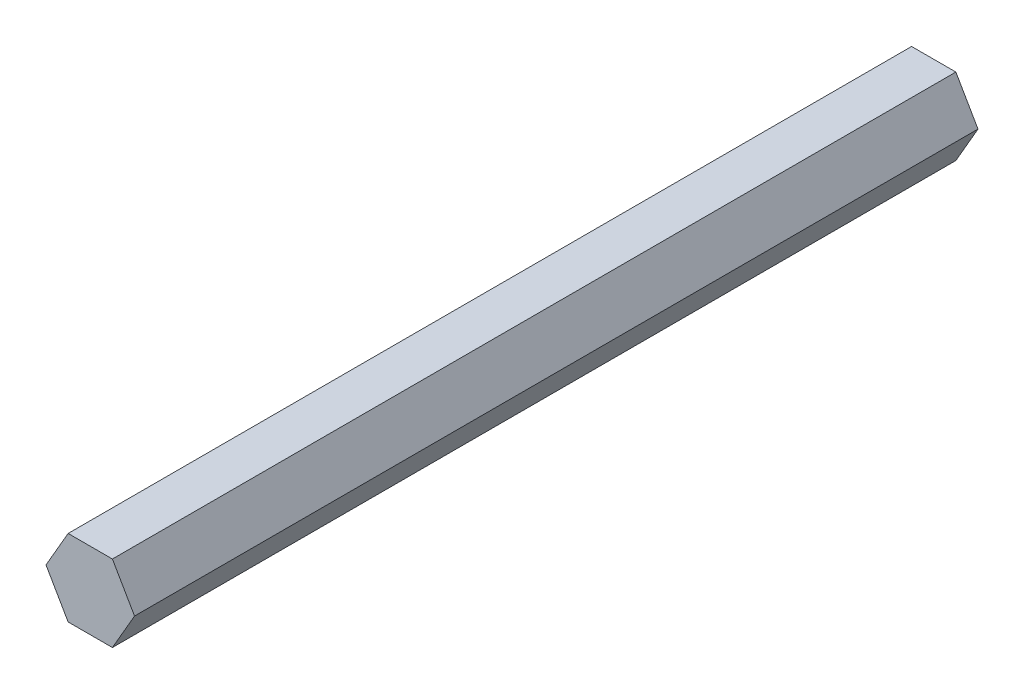
ISO-10303-21;
HEADER;
FILE_DESCRIPTION(('STEP AP214'),'2;1');
FILE_NAME('part.step','',(''),(''),'','','');
FILE_SCHEMA(('AUTOMOTIVE_DESIGN { 1 0 10303 214 1 1 1 1 }'));
ENDSEC;
DATA;
#1=APPLICATION_CONTEXT('core data for automotive mechanical design processes');
#2=APPLICATION_PROTOCOL_DEFINITION('international standard','automotive_design',2000,#1);
#3=PRODUCT_CONTEXT('',#1,'mechanical');
#4=PRODUCT('Part','Part','',(#3));
#5=PRODUCT_RELATED_PRODUCT_CATEGORY('part','',(#4));
#6=PRODUCT_DEFINITION_FORMATION('','',#4);
#7=PRODUCT_DEFINITION_CONTEXT('part definition',#1,'design');
#8=PRODUCT_DEFINITION('design','',#6,#7);
#9=PRODUCT_DEFINITION_SHAPE('','',#8);
#10=(LENGTH_UNIT() NAMED_UNIT(*) SI_UNIT(.MILLI.,.METRE.));
#11=(NAMED_UNIT(*) PLANE_ANGLE_UNIT() SI_UNIT($,.RADIAN.));
#12=(NAMED_UNIT(*) SI_UNIT($,.STERADIAN.) SOLID_ANGLE_UNIT());
#13=UNCERTAINTY_MEASURE_WITH_UNIT(LENGTH_MEASURE(1.E-05),#10,'distance_accuracy_value','');
#14=(GEOMETRIC_REPRESENTATION_CONTEXT(3) GLOBAL_UNCERTAINTY_ASSIGNED_CONTEXT((#13)) GLOBAL_UNIT_ASSIGNED_CONTEXT((#10,
#11,#12)) REPRESENTATION_CONTEXT('',''));
#15=CARTESIAN_POINT('',(0.,0.,0.));
#16=DIRECTION('',(0.,0.,1.));
#17=DIRECTION('',(1.,0.,0.));
#18=AXIS2_PLACEMENT_3D('',#15,#16,#17);
#19=CARTESIAN_POINT('',(-1.44337567297406,-2.5,55.));
#20=DIRECTION('',(0.,1.,0.));
#21=DIRECTION('',(-1.,0.,0.));
#22=AXIS2_PLACEMENT_3D('',#19,#20,#21);
#23=PLANE('',#22);
#24=DIRECTION('',(1.,0.,0.));
#25=VECTOR('',#24,1.);
#26=CARTESIAN_POINT('',(-1.44337567297406,-2.5,0.));
#27=LINE('',#26,#25);
#28=CARTESIAN_POINT('',(-1.44337567297406,-2.5,0.));
#29=VERTEX_POINT('',#28);
#30=CARTESIAN_POINT('',(1.44337567297406,-2.5,0.));
#31=VERTEX_POINT('',#30);
#32=EDGE_CURVE('E121',#29,#31,#27,.T.);
#33=ORIENTED_EDGE('',*,*,#32,.T.);
#34=DIRECTION('',(0.,0.,-1.));
#35=VECTOR('',#34,1.);
#36=CARTESIAN_POINT('',(1.44337567297406,-2.5,55.));
#37=LINE('',#36,#35);
#38=CARTESIAN_POINT('',(1.44337567297406,-2.5,55.));
#39=VERTEX_POINT('',#38);
#40=EDGE_CURVE('E11',#39,#31,#37,.T.);
#41=ORIENTED_EDGE('',*,*,#40,.F.);
#42=DIRECTION('',(1.,0.,0.));
#43=VECTOR('',#42,1.);
#44=CARTESIAN_POINT('',(-1.44337567297406,-2.5,55.));
#45=LINE('',#44,#43);
#46=CARTESIAN_POINT('',(-1.44337567297406,-2.5,55.));
#47=VERTEX_POINT('',#46);
#48=EDGE_CURVE('E131',#47,#39,#45,.T.);
#49=ORIENTED_EDGE('',*,*,#48,.F.);
#50=DIRECTION('',(0.,0.,-1.));
#51=VECTOR('',#50,1.);
#52=CARTESIAN_POINT('',(-1.44337567297406,-2.5,55.));
#53=LINE('',#52,#51);
#54=EDGE_CURVE('E117',#47,#29,#53,.T.);
#55=ORIENTED_EDGE('',*,*,#54,.T.);
#56=EDGE_LOOP('',(#33,#41,#49,#55));
#57=FACE_BOUND('',#56,.T.);
#58=ADVANCED_FACE('F37',(#57),#23,.F.);
#59=CARTESIAN_POINT('',(1.44337567297406,-2.5,55.));
#60=DIRECTION('',(-0.866025403784439,0.5,0.));
#61=DIRECTION('',(-0.5,-0.866025403784439,0.));
#62=AXIS2_PLACEMENT_3D('',#59,#60,#61);
#63=PLANE('',#62);
#64=DIRECTION('',(0.5,0.866025403784439,0.));
#65=VECTOR('',#64,1.);
#66=CARTESIAN_POINT('',(1.44337567297406,-2.5,0.));
#67=LINE('',#66,#65);
#68=CARTESIAN_POINT('',(2.88675134594813,0.,0.));
#69=VERTEX_POINT('',#68);
#70=EDGE_CURVE('E124',#31,#69,#67,.T.);
#71=ORIENTED_EDGE('',*,*,#70,.T.);
#72=DIRECTION('',(0.,0.,-1.));
#73=VECTOR('',#72,1.);
#74=CARTESIAN_POINT('',(2.88675134594813,0.,55.));
#75=LINE('',#74,#73);
#76=CARTESIAN_POINT('',(2.88675134594813,0.,55.));
#77=VERTEX_POINT('',#76);
#78=EDGE_CURVE('E45',#77,#69,#75,.T.);
#79=ORIENTED_EDGE('',*,*,#78,.F.);
#80=DIRECTION('',(0.5,0.866025403784439,0.));
#81=VECTOR('',#80,1.);
#82=CARTESIAN_POINT('',(1.44337567297406,-2.5,55.));
#83=LINE('',#82,#81);
#84=EDGE_CURVE('E90',#39,#77,#83,.T.);
#85=ORIENTED_EDGE('',*,*,#84,.F.);
#86=ORIENTED_EDGE('',*,*,#40,.T.);
#87=EDGE_LOOP('',(#71,#79,#85,#86));
#88=FACE_BOUND('',#87,.T.);
#89=ADVANCED_FACE('F155',(#88),#63,.F.);
#90=CARTESIAN_POINT('',(2.88675134594813,0.,55.));
#91=DIRECTION('',(-0.866025403784439,-0.5,0.));
#92=DIRECTION('',(0.5,-0.866025403784439,0.));
#93=AXIS2_PLACEMENT_3D('',#90,#91,#92);
#94=PLANE('',#93);
#95=DIRECTION('',(-0.5,0.866025403784439,0.));
#96=VECTOR('',#95,1.);
#97=CARTESIAN_POINT('',(2.88675134594813,0.,0.));
#98=LINE('',#97,#96);
#99=CARTESIAN_POINT('',(1.44337567297406,2.5,0.));
#100=VERTEX_POINT('',#99);
#101=EDGE_CURVE('E126',#69,#100,#98,.T.);
#102=ORIENTED_EDGE('',*,*,#101,.T.);
#103=DIRECTION('',(0.,0.,-1.));
#104=VECTOR('',#103,1.);
#105=CARTESIAN_POINT('',(1.44337567297406,2.5,55.));
#106=LINE('',#105,#104);
#107=CARTESIAN_POINT('',(1.44337567297406,2.5,55.));
#108=VERTEX_POINT('',#107);
#109=EDGE_CURVE('E112',#108,#100,#106,.T.);
#110=ORIENTED_EDGE('',*,*,#109,.F.);
#111=DIRECTION('',(-0.5,0.866025403784439,0.));
#112=VECTOR('',#111,1.);
#113=CARTESIAN_POINT('',(2.88675134594813,0.,55.));
#114=LINE('',#113,#112);
#115=EDGE_CURVE('E103',#77,#108,#114,.T.);
#116=ORIENTED_EDGE('',*,*,#115,.F.);
#117=ORIENTED_EDGE('',*,*,#78,.T.);
#118=EDGE_LOOP('',(#102,#110,#116,#117));
#119=FACE_BOUND('',#118,.T.);
#120=ADVANCED_FACE('F137',(#119),#94,.F.);
#121=CARTESIAN_POINT('',(1.44337567297406,2.5,55.));
#122=DIRECTION('',(0.,-1.,0.));
#123=DIRECTION('',(0.,0.,-1.));
#124=AXIS2_PLACEMENT_3D('',#121,#122,#123);
#125=PLANE('',#124);
#126=DIRECTION('',(-1.,0.,0.));
#127=VECTOR('',#126,1.);
#128=CARTESIAN_POINT('',(1.44337567297406,2.5,0.));
#129=LINE('',#128,#127);
#130=CARTESIAN_POINT('',(-1.44337567297406,2.5,0.));
#131=VERTEX_POINT('',#130);
#132=EDGE_CURVE('E111',#100,#131,#129,.T.);
#133=ORIENTED_EDGE('',*,*,#132,.T.);
#134=DIRECTION('',(0.,0.,-1.));
#135=VECTOR('',#134,1.);
#136=CARTESIAN_POINT('',(-1.44337567297406,2.5,55.));
#137=LINE('',#136,#135);
#138=CARTESIAN_POINT('',(-1.44337567297406,2.5,55.));
#139=VERTEX_POINT('',#138);
#140=EDGE_CURVE('E108',#139,#131,#137,.T.);
#141=ORIENTED_EDGE('',*,*,#140,.F.);
#142=DIRECTION('',(-1.,0.,0.));
#143=VECTOR('',#142,1.);
#144=CARTESIAN_POINT('',(1.44337567297406,2.5,55.));
#145=LINE('',#144,#143);
#146=EDGE_CURVE('E97',#108,#139,#145,.T.);
#147=ORIENTED_EDGE('',*,*,#146,.F.);
#148=ORIENTED_EDGE('',*,*,#109,.T.);
#149=EDGE_LOOP('',(#133,#141,#147,#148));
#150=FACE_BOUND('',#149,.T.);
#151=ADVANCED_FACE('F109',(#150),#125,.F.);
#152=CARTESIAN_POINT('',(-1.44337567297406,2.5,55.));
#153=DIRECTION('',(0.866025403784439,-0.5,0.));
#154=DIRECTION('',(0.5,0.866025403784439,0.));
#155=AXIS2_PLACEMENT_3D('',#152,#153,#154);
#156=PLANE('',#155);
#157=DIRECTION('',(-0.5,-0.866025403784439,0.));
#158=VECTOR('',#157,1.);
#159=CARTESIAN_POINT('',(-1.44337567297406,2.5,0.));
#160=LINE('',#159,#158);
#161=CARTESIAN_POINT('',(-2.88675134594813,0.,0.));
#162=VERTEX_POINT('',#161);
#163=EDGE_CURVE('E76',#131,#162,#160,.T.);
#164=ORIENTED_EDGE('',*,*,#163,.T.);
#165=DIRECTION('',(0.,0.,-1.));
#166=VECTOR('',#165,1.);
#167=CARTESIAN_POINT('',(-2.88675134594813,0.,55.));
#168=LINE('',#167,#166);
#169=CARTESIAN_POINT('',(-2.88675134594813,0.,55.));
#170=VERTEX_POINT('',#169);
#171=EDGE_CURVE('E113',#170,#162,#168,.T.);
#172=ORIENTED_EDGE('',*,*,#171,.F.);
#173=DIRECTION('',(-0.5,-0.866025403784439,0.));
#174=VECTOR('',#173,1.);
#175=CARTESIAN_POINT('',(-1.44337567297406,2.5,55.));
#176=LINE('',#175,#174);
#177=EDGE_CURVE('E101',#139,#170,#176,.T.);
#178=ORIENTED_EDGE('',*,*,#177,.F.);
#179=ORIENTED_EDGE('',*,*,#140,.T.);
#180=EDGE_LOOP('',(#164,#172,#178,#179));
#181=FACE_BOUND('',#180,.T.);
#182=ADVANCED_FACE('F115',(#181),#156,.F.);
#183=CARTESIAN_POINT('',(-2.88675134594813,0.,55.));
#184=DIRECTION('',(0.866025403784439,0.5,0.));
#185=DIRECTION('',(-0.5,0.866025403784439,0.));
#186=AXIS2_PLACEMENT_3D('',#183,#184,#185);
#187=PLANE('',#186);
#188=DIRECTION('',(0.5,-0.866025403784438,0.));
#189=VECTOR('',#188,1.);
#190=CARTESIAN_POINT('',(-2.88675134594813,0.,0.));
#191=LINE('',#190,#189);
#192=EDGE_CURVE('E82',#162,#29,#191,.T.);
#193=ORIENTED_EDGE('',*,*,#192,.T.);
#194=ORIENTED_EDGE('',*,*,#54,.F.);
#195=DIRECTION('',(0.5,-0.866025403784438,0.));
#196=VECTOR('',#195,1.);
#197=CARTESIAN_POINT('',(-2.88675134594813,0.,55.));
#198=LINE('',#197,#196);
#199=EDGE_CURVE('E53',#170,#47,#198,.T.);
#200=ORIENTED_EDGE('',*,*,#199,.F.);
#201=ORIENTED_EDGE('',*,*,#171,.T.);
#202=EDGE_LOOP('',(#193,#194,#200,#201));
#203=FACE_BOUND('',#202,.T.);
#204=ADVANCED_FACE('F144',(#203),#187,.F.);
#205=CARTESIAN_POINT('',(0.,0.,55.));
#206=DIRECTION('',(0.,0.,1.));
#207=DIRECTION('',(1.,0.,0.));
#208=AXIS2_PLACEMENT_3D('',#205,#206,#207);
#209=PLANE('',#208);
#210=ORIENTED_EDGE('',*,*,#48,.T.);
#211=ORIENTED_EDGE('',*,*,#84,.T.);
#212=ORIENTED_EDGE('',*,*,#115,.T.);
#213=ORIENTED_EDGE('',*,*,#146,.T.);
#214=ORIENTED_EDGE('',*,*,#177,.T.);
#215=ORIENTED_EDGE('',*,*,#199,.T.);
#216=EDGE_LOOP('',(#210,#211,#212,#213,#214,#215));
#217=FACE_BOUND('',#216,.T.);
#218=ADVANCED_FACE('F99',(#217),#209,.T.);
#219=CARTESIAN_POINT('',(0.,0.,0.));
#220=DIRECTION('',(0.,0.,1.));
#221=DIRECTION('',(1.,0.,0.));
#222=AXIS2_PLACEMENT_3D('',#219,#220,#221);
#223=PLANE('',#222);
#224=ORIENTED_EDGE('',*,*,#32,.F.);
#225=ORIENTED_EDGE('',*,*,#192,.F.);
#226=ORIENTED_EDGE('',*,*,#163,.F.);
#227=ORIENTED_EDGE('',*,*,#132,.F.);
#228=ORIENTED_EDGE('',*,*,#101,.F.);
#229=ORIENTED_EDGE('',*,*,#70,.F.);
#230=EDGE_LOOP('',(#224,#225,#226,#227,#228,#229));
#231=FACE_BOUND('',#230,.T.);
#232=ADVANCED_FACE('F140',(#231),#223,.F.);
#233=CLOSED_SHELL('',(#58,#89,#120,#151,#182,#204,#218,#232));
#234=MANIFOLD_SOLID_BREP('B2',#233);
#235=ADVANCED_BREP_SHAPE_REPRESENTATION('',(#18,#234),#14);
#236=SHAPE_DEFINITION_REPRESENTATION(#9,#235);
ENDSEC;
END-ISO-10303-21;
